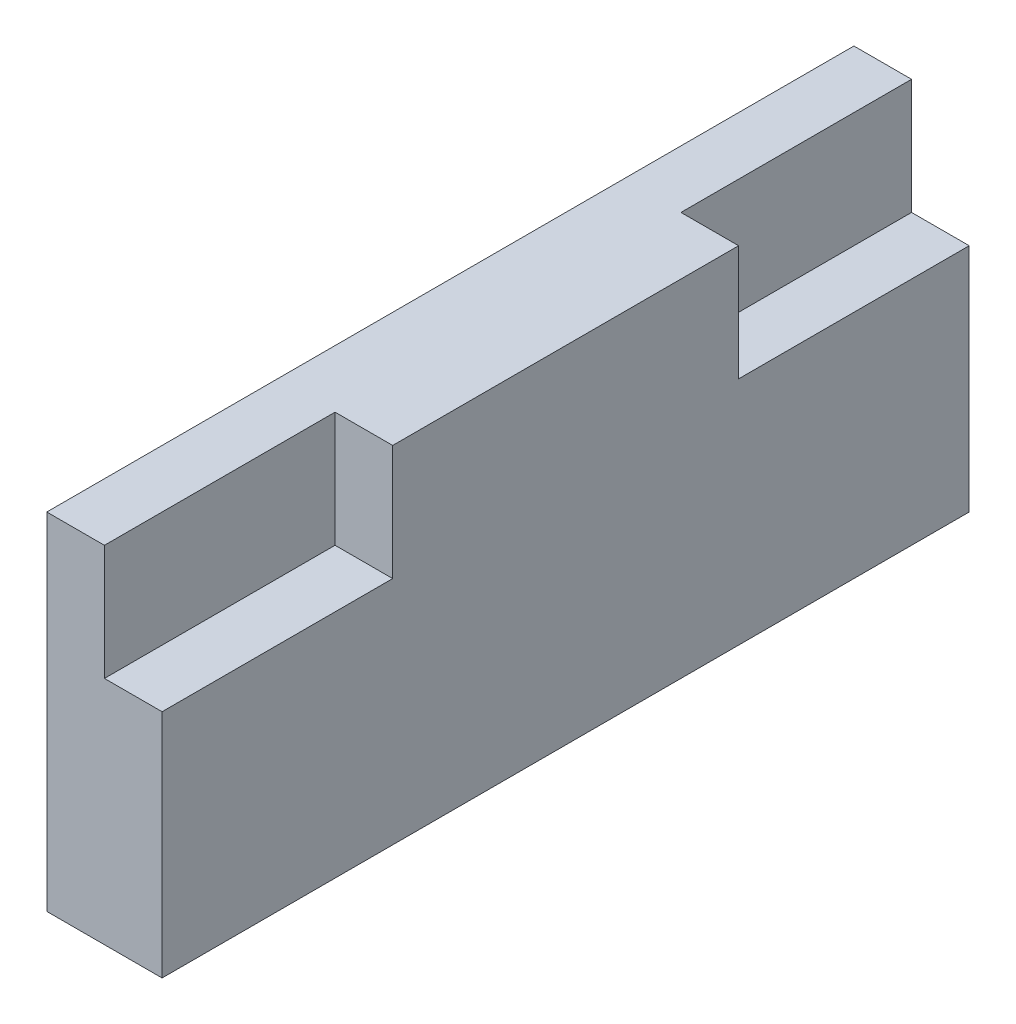
ISO-10303-21;
HEADER;
FILE_DESCRIPTION(('STEP AP214'),'2;1');
FILE_NAME('part.step','',(''),(''),'','','');
FILE_SCHEMA(('AUTOMOTIVE_DESIGN { 1 0 10303 214 1 1 1 1 }'));
ENDSEC;
DATA;
#1=APPLICATION_CONTEXT('core data for automotive mechanical design processes');
#2=APPLICATION_PROTOCOL_DEFINITION('international standard','automotive_design',2000,#1);
#3=PRODUCT_CONTEXT('',#1,'mechanical');
#4=PRODUCT('Part','Part','',(#3));
#5=PRODUCT_RELATED_PRODUCT_CATEGORY('part','',(#4));
#6=PRODUCT_DEFINITION_FORMATION('','',#4);
#7=PRODUCT_DEFINITION_CONTEXT('part definition',#1,'design');
#8=PRODUCT_DEFINITION('design','',#6,#7);
#9=PRODUCT_DEFINITION_SHAPE('','',#8);
#10=(LENGTH_UNIT() NAMED_UNIT(*) SI_UNIT(.MILLI.,.METRE.));
#11=(NAMED_UNIT(*) PLANE_ANGLE_UNIT() SI_UNIT($,.RADIAN.));
#12=(NAMED_UNIT(*) SI_UNIT($,.STERADIAN.) SOLID_ANGLE_UNIT());
#13=UNCERTAINTY_MEASURE_WITH_UNIT(LENGTH_MEASURE(1.E-05),#10,'distance_accuracy_value','');
#14=(GEOMETRIC_REPRESENTATION_CONTEXT(3) GLOBAL_UNCERTAINTY_ASSIGNED_CONTEXT((#13)) GLOBAL_UNIT_ASSIGNED_CONTEXT((#10,
#11,#12)) REPRESENTATION_CONTEXT('',''));
#15=CARTESIAN_POINT('',(0.,0.,0.));
#16=DIRECTION('',(0.,0.,1.));
#17=DIRECTION('',(1.,0.,0.));
#18=AXIS2_PLACEMENT_3D('',#15,#16,#17);
#19=CARTESIAN_POINT('',(-138.05775862069,76.2,-116.243318965517));
#20=DIRECTION('',(1.,0.,0.));
#21=DIRECTION('',(0.,0.,-1.));
#22=AXIS2_PLACEMENT_3D('',#19,#20,#21);
#23=PLANE('',#22);
#24=DIRECTION('',(0.,0.,1.));
#25=VECTOR('',#24,1.);
#26=CARTESIAN_POINT('',(-138.05775862069,0.,-116.243318965517));
#27=LINE('',#26,#25);
#28=CARTESIAN_POINT('',(-138.05775862069,0.,-116.243318965517));
#29=VERTEX_POINT('',#28);
#30=CARTESIAN_POINT('',(-138.05775862069,0.,61.5566810344828));
#31=VERTEX_POINT('',#30);
#32=EDGE_CURVE('E170',#29,#31,#27,.T.);
#33=ORIENTED_EDGE('',*,*,#32,.T.);
#34=DIRECTION('',(0.,-1.,0.));
#35=VECTOR('',#34,1.);
#36=CARTESIAN_POINT('',(-138.05775862069,76.2,61.5566810344828));
#37=LINE('',#36,#35);
#38=CARTESIAN_POINT('',(-138.05775862069,76.2,61.5566810344828));
#39=VERTEX_POINT('',#38);
#40=EDGE_CURVE('E11',#39,#31,#37,.T.);
#41=ORIENTED_EDGE('',*,*,#40,.F.);
#42=DIRECTION('',(0.,0.,1.));
#43=VECTOR('',#42,1.);
#44=CARTESIAN_POINT('',(-138.05775862069,76.2,-116.243318965517));
#45=LINE('',#44,#43);
#46=CARTESIAN_POINT('',(-138.05775862069,76.2,-116.243318965517));
#47=VERTEX_POINT('',#46);
#48=EDGE_CURVE('E158',#47,#39,#45,.T.);
#49=ORIENTED_EDGE('',*,*,#48,.F.);
#50=DIRECTION('',(0.,-1.,0.));
#51=VECTOR('',#50,1.);
#52=CARTESIAN_POINT('',(-138.05775862069,76.2,-116.243318965517));
#53=LINE('',#52,#51);
#54=EDGE_CURVE('E169',#47,#29,#53,.T.);
#55=ORIENTED_EDGE('',*,*,#54,.T.);
#56=EDGE_LOOP('',(#33,#41,#49,#55));
#57=FACE_BOUND('',#56,.T.);
#58=ADVANCED_FACE('F33',(#57),#23,.F.);
#59=CARTESIAN_POINT('',(-138.05775862069,76.2,61.5566810344828));
#60=DIRECTION('',(0.,0.,-1.));
#61=DIRECTION('',(-1.,0.,0.));
#62=AXIS2_PLACEMENT_3D('',#59,#60,#61);
#63=PLANE('',#62);
#64=DIRECTION('',(0.,-1.,0.));
#65=VECTOR('',#64,1.);
#66=CARTESIAN_POINT('',(-112.65775862069,76.2,61.5566810344828));
#67=LINE('',#66,#65);
#68=CARTESIAN_POINT('',(-112.65775862069,50.8,61.5566810344828));
#69=VERTEX_POINT('',#68);
#70=CARTESIAN_POINT('',(-112.65775862069,0.,61.5566810344828));
#71=VERTEX_POINT('',#70);
#72=EDGE_CURVE('E40',#69,#71,#67,.T.);
#73=ORIENTED_EDGE('',*,*,#72,.F.);
#74=DIRECTION('',(1.,0.,0.));
#75=VECTOR('',#74,1.);
#76=CARTESIAN_POINT('',(-125.35775862069,50.8,61.5566810344828));
#77=LINE('',#76,#75);
#78=CARTESIAN_POINT('',(-125.35775862069,50.8,61.5566810344828));
#79=VERTEX_POINT('',#78);
#80=EDGE_CURVE('E115',#79,#69,#77,.T.);
#81=ORIENTED_EDGE('',*,*,#80,.F.);
#82=DIRECTION('',(0.,-1.,0.));
#83=VECTOR('',#82,1.);
#84=CARTESIAN_POINT('',(-125.35775862069,76.2,61.5566810344828));
#85=LINE('',#84,#83);
#86=CARTESIAN_POINT('',(-125.35775862069,76.2,61.5566810344828));
#87=VERTEX_POINT('',#86);
#88=EDGE_CURVE('E118',#87,#79,#85,.T.);
#89=ORIENTED_EDGE('',*,*,#88,.F.);
#90=DIRECTION('',(1.,0.,0.));
#91=VECTOR('',#90,1.);
#92=CARTESIAN_POINT('',(-138.05775862069,76.2,61.5566810344828));
#93=LINE('',#92,#91);
#94=EDGE_CURVE('E161',#39,#87,#93,.T.);
#95=ORIENTED_EDGE('',*,*,#94,.F.);
#96=ORIENTED_EDGE('',*,*,#40,.T.);
#97=DIRECTION('',(1.,0.,0.));
#98=VECTOR('',#97,1.);
#99=CARTESIAN_POINT('',(-138.05775862069,0.,61.5566810344828));
#100=LINE('',#99,#98);
#101=EDGE_CURVE('E173',#31,#71,#100,.T.);
#102=ORIENTED_EDGE('',*,*,#101,.T.);
#103=EDGE_LOOP('',(#73,#81,#89,#95,#96,#102));
#104=FACE_BOUND('',#103,.T.);
#105=ADVANCED_FACE('F129',(#104),#63,.F.);
#106=CARTESIAN_POINT('',(-112.65775862069,76.2,-116.243318965517));
#107=DIRECTION('',(-1.,0.,0.));
#108=DIRECTION('',(0.,0.,1.));
#109=AXIS2_PLACEMENT_3D('',#106,#107,#108);
#110=PLANE('',#109);
#111=DIRECTION('',(0.,0.,-1.));
#112=VECTOR('',#111,1.);
#113=CARTESIAN_POINT('',(-112.65775862069,76.2,-116.243318965517));
#114=LINE('',#113,#112);
#115=CARTESIAN_POINT('',(-112.65775862069,76.2,10.7566810344828));
#116=VERTEX_POINT('',#115);
#117=CARTESIAN_POINT('',(-112.65775862069,76.2,-65.4433189655172));
#118=VERTEX_POINT('',#117);
#119=EDGE_CURVE('E164',#116,#118,#114,.T.);
#120=ORIENTED_EDGE('',*,*,#119,.F.);
#121=DIRECTION('',(0.,1.,0.));
#122=VECTOR('',#121,1.);
#123=CARTESIAN_POINT('',(-112.65775862069,76.2,10.7566810344828));
#124=LINE('',#123,#122);
#125=CARTESIAN_POINT('',(-112.65775862069,50.8,10.7566810344828));
#126=VERTEX_POINT('',#125);
#127=EDGE_CURVE('E126',#126,#116,#124,.T.);
#128=ORIENTED_EDGE('',*,*,#127,.F.);
#129=DIRECTION('',(0.,0.,-1.));
#130=VECTOR('',#129,1.);
#131=CARTESIAN_POINT('',(-112.65775862069,50.8,61.5566810344828));
#132=LINE('',#131,#130);
#133=EDGE_CURVE('E154',#69,#126,#132,.T.);
#134=ORIENTED_EDGE('',*,*,#133,.F.);
#135=ORIENTED_EDGE('',*,*,#72,.T.);
#136=DIRECTION('',(0.,0.,-1.));
#137=VECTOR('',#136,1.);
#138=CARTESIAN_POINT('',(-112.65775862069,0.,-116.243318965517));
#139=LINE('',#138,#137);
#140=CARTESIAN_POINT('',(-112.65775862069,0.,-116.243318965517));
#141=VERTEX_POINT('',#140);
#142=EDGE_CURVE('E175',#71,#141,#139,.T.);
#143=ORIENTED_EDGE('',*,*,#142,.T.);
#144=DIRECTION('',(0.,-1.,0.));
#145=VECTOR('',#144,1.);
#146=CARTESIAN_POINT('',(-112.65775862069,76.2,-116.243318965517));
#147=LINE('',#146,#145);
#148=CARTESIAN_POINT('',(-112.65775862069,50.8,-116.243318965517));
#149=VERTEX_POINT('',#148);
#150=EDGE_CURVE('E181',#149,#141,#147,.T.);
#151=ORIENTED_EDGE('',*,*,#150,.F.);
#152=DIRECTION('',(0.,0.,-1.));
#153=VECTOR('',#152,1.);
#154=CARTESIAN_POINT('',(-112.65775862069,50.8,-116.243318965517));
#155=LINE('',#154,#153);
#156=CARTESIAN_POINT('',(-112.65775862069,50.8,-65.4433189655172));
#157=VERTEX_POINT('',#156);
#158=EDGE_CURVE('E139',#157,#149,#155,.T.);
#159=ORIENTED_EDGE('',*,*,#158,.F.);
#160=DIRECTION('',(0.,-1.,0.));
#161=VECTOR('',#160,1.);
#162=CARTESIAN_POINT('',(-112.65775862069,76.2,-65.4433189655172));
#163=LINE('',#162,#161);
#164=EDGE_CURVE('E147',#118,#157,#163,.T.);
#165=ORIENTED_EDGE('',*,*,#164,.F.);
#166=EDGE_LOOP('',(#120,#128,#134,#135,#143,#151,#159,#165));
#167=FACE_BOUND('',#166,.T.);
#168=ADVANCED_FACE('F184',(#167),#110,.F.);
#169=CARTESIAN_POINT('',(-138.05775862069,76.2,-116.243318965517));
#170=DIRECTION('',(0.,0.,1.));
#171=DIRECTION('',(1.,0.,0.));
#172=AXIS2_PLACEMENT_3D('',#169,#170,#171);
#173=PLANE('',#172);
#174=DIRECTION('',(0.,1.,0.));
#175=VECTOR('',#174,1.);
#176=CARTESIAN_POINT('',(-125.35775862069,76.2,-116.243318965517));
#177=LINE('',#176,#175);
#178=CARTESIAN_POINT('',(-125.35775862069,50.8,-116.243318965517));
#179=VERTEX_POINT('',#178);
#180=CARTESIAN_POINT('',(-125.35775862069,76.2,-116.243318965517));
#181=VERTEX_POINT('',#180);
#182=EDGE_CURVE('E55',#179,#181,#177,.T.);
#183=ORIENTED_EDGE('',*,*,#182,.F.);
#184=DIRECTION('',(1.,0.,0.));
#185=VECTOR('',#184,1.);
#186=CARTESIAN_POINT('',(-125.35775862069,50.8,-116.243318965517));
#187=LINE('',#186,#185);
#188=EDGE_CURVE('E151',#179,#149,#187,.T.);
#189=ORIENTED_EDGE('',*,*,#188,.T.);
#190=ORIENTED_EDGE('',*,*,#150,.T.);
#191=DIRECTION('',(-1.,0.,0.));
#192=VECTOR('',#191,1.);
#193=CARTESIAN_POINT('',(-138.05775862069,0.,-116.243318965517));
#194=LINE('',#193,#192);
#195=EDGE_CURVE('E162',#141,#29,#194,.T.);
#196=ORIENTED_EDGE('',*,*,#195,.T.);
#197=ORIENTED_EDGE('',*,*,#54,.F.);
#198=DIRECTION('',(-1.,0.,0.));
#199=VECTOR('',#198,1.);
#200=CARTESIAN_POINT('',(-138.05775862069,76.2,-116.243318965517));
#201=LINE('',#200,#199);
#202=EDGE_CURVE('E167',#181,#47,#201,.T.);
#203=ORIENTED_EDGE('',*,*,#202,.F.);
#204=EDGE_LOOP('',(#183,#189,#190,#196,#197,#203));
#205=FACE_BOUND('',#204,.T.);
#206=ADVANCED_FACE('F195',(#205),#173,.F.);
#207=CARTESIAN_POINT('',(0.,76.2,0.));
#208=DIRECTION('',(0.,1.,0.));
#209=DIRECTION('',(0.,0.,1.));
#210=AXIS2_PLACEMENT_3D('',#207,#208,#209);
#211=PLANE('',#210);
#212=DIRECTION('',(1.,0.,0.));
#213=VECTOR('',#212,1.);
#214=CARTESIAN_POINT('',(-125.35775862069,76.2,10.7566810344828));
#215=LINE('',#214,#213);
#216=CARTESIAN_POINT('',(-125.35775862069,76.2,10.7566810344828));
#217=VERTEX_POINT('',#216);
#218=EDGE_CURVE('E132',#217,#116,#215,.T.);
#219=ORIENTED_EDGE('',*,*,#218,.T.);
#220=ORIENTED_EDGE('',*,*,#119,.T.);
#221=DIRECTION('',(1.,0.,0.));
#222=VECTOR('',#221,1.);
#223=CARTESIAN_POINT('',(-125.35775862069,76.2,-65.4433189655172));
#224=LINE('',#223,#222);
#225=CARTESIAN_POINT('',(-125.35775862069,76.2,-65.4433189655172));
#226=VERTEX_POINT('',#225);
#227=EDGE_CURVE('E146',#226,#118,#224,.T.);
#228=ORIENTED_EDGE('',*,*,#227,.F.);
#229=DIRECTION('',(0.,0.,1.));
#230=VECTOR('',#229,1.);
#231=CARTESIAN_POINT('',(-125.35775862069,76.2,-116.243318965517));
#232=LINE('',#231,#230);
#233=EDGE_CURVE('E138',#181,#226,#232,.T.);
#234=ORIENTED_EDGE('',*,*,#233,.F.);
#235=ORIENTED_EDGE('',*,*,#202,.T.);
#236=ORIENTED_EDGE('',*,*,#48,.T.);
#237=ORIENTED_EDGE('',*,*,#94,.T.);
#238=DIRECTION('',(0.,0.,1.));
#239=VECTOR('',#238,1.);
#240=CARTESIAN_POINT('',(-125.35775862069,76.2,61.5566810344828));
#241=LINE('',#240,#239);
#242=EDGE_CURVE('E123',#217,#87,#241,.T.);
#243=ORIENTED_EDGE('',*,*,#242,.F.);
#244=EDGE_LOOP('',(#219,#220,#228,#234,#235,#236,#237,#243));
#245=FACE_BOUND('',#244,.T.);
#246=ADVANCED_FACE('F201',(#245),#211,.T.);
#247=CARTESIAN_POINT('',(0.,0.,0.));
#248=DIRECTION('',(0.,1.,0.));
#249=DIRECTION('',(0.,0.,1.));
#250=AXIS2_PLACEMENT_3D('',#247,#248,#249);
#251=PLANE('',#250);
#252=ORIENTED_EDGE('',*,*,#32,.F.);
#253=ORIENTED_EDGE('',*,*,#195,.F.);
#254=ORIENTED_EDGE('',*,*,#142,.F.);
#255=ORIENTED_EDGE('',*,*,#101,.F.);
#256=EDGE_LOOP('',(#252,#253,#254,#255));
#257=FACE_BOUND('',#256,.T.);
#258=ADVANCED_FACE('F192',(#257),#251,.F.);
#259=CARTESIAN_POINT('',(-125.35775862069,50.8,-116.243318965517));
#260=DIRECTION('',(0.,-1.,0.));
#261=DIRECTION('',(0.,0.,-1.));
#262=AXIS2_PLACEMENT_3D('',#259,#260,#261);
#263=PLANE('',#262);
#264=ORIENTED_EDGE('',*,*,#158,.T.);
#265=ORIENTED_EDGE('',*,*,#188,.F.);
#266=DIRECTION('',(0.,0.,-1.));
#267=VECTOR('',#266,1.);
#268=CARTESIAN_POINT('',(-125.35775862069,50.8,-116.243318965517));
#269=LINE('',#268,#267);
#270=CARTESIAN_POINT('',(-125.35775862069,50.8,-65.4433189655172));
#271=VERTEX_POINT('',#270);
#272=EDGE_CURVE('E144',#271,#179,#269,.T.);
#273=ORIENTED_EDGE('',*,*,#272,.F.);
#274=DIRECTION('',(1.,0.,0.));
#275=VECTOR('',#274,1.);
#276=CARTESIAN_POINT('',(-125.35775862069,50.8,-65.4433189655172));
#277=LINE('',#276,#275);
#278=EDGE_CURVE('E155',#271,#157,#277,.T.);
#279=ORIENTED_EDGE('',*,*,#278,.T.);
#280=EDGE_LOOP('',(#264,#265,#273,#279));
#281=FACE_BOUND('',#280,.T.);
#282=ADVANCED_FACE('F207',(#281),#263,.F.);
#283=CARTESIAN_POINT('',(-125.35775862069,76.2,-65.4433189655172));
#284=DIRECTION('',(0.,0.,1.));
#285=DIRECTION('',(1.,0.,0.));
#286=AXIS2_PLACEMENT_3D('',#283,#284,#285);
#287=PLANE('',#286);
#288=ORIENTED_EDGE('',*,*,#164,.T.);
#289=ORIENTED_EDGE('',*,*,#278,.F.);
#290=DIRECTION('',(0.,-1.,0.));
#291=VECTOR('',#290,1.);
#292=CARTESIAN_POINT('',(-125.35775862069,76.2,-65.4433189655172));
#293=LINE('',#292,#291);
#294=EDGE_CURVE('E141',#226,#271,#293,.T.);
#295=ORIENTED_EDGE('',*,*,#294,.F.);
#296=ORIENTED_EDGE('',*,*,#227,.T.);
#297=EDGE_LOOP('',(#288,#289,#295,#296));
#298=FACE_BOUND('',#297,.T.);
#299=ADVANCED_FACE('F209',(#298),#287,.F.);
#300=CARTESIAN_POINT('',(-125.35775862069,0.,0.));
#301=DIRECTION('',(-1.,0.,0.));
#302=DIRECTION('',(0.,0.,1.));
#303=AXIS2_PLACEMENT_3D('',#300,#301,#302);
#304=PLANE('',#303);
#305=ORIENTED_EDGE('',*,*,#182,.T.);
#306=ORIENTED_EDGE('',*,*,#233,.T.);
#307=ORIENTED_EDGE('',*,*,#294,.T.);
#308=ORIENTED_EDGE('',*,*,#272,.T.);
#309=EDGE_LOOP('',(#305,#306,#307,#308));
#310=FACE_BOUND('',#309,.T.);
#311=ADVANCED_FACE('F216',(#310),#304,.F.);
#312=CARTESIAN_POINT('',(-125.35775862069,76.2,10.7566810344828));
#313=DIRECTION('',(0.,0.,-1.));
#314=DIRECTION('',(-1.,0.,0.));
#315=AXIS2_PLACEMENT_3D('',#312,#313,#314);
#316=PLANE('',#315);
#317=ORIENTED_EDGE('',*,*,#127,.T.);
#318=ORIENTED_EDGE('',*,*,#218,.F.);
#319=DIRECTION('',(0.,1.,0.));
#320=VECTOR('',#319,1.);
#321=CARTESIAN_POINT('',(-125.35775862069,76.2,10.7566810344828));
#322=LINE('',#321,#320);
#323=CARTESIAN_POINT('',(-125.35775862069,50.8,10.7566810344828));
#324=VERTEX_POINT('',#323);
#325=EDGE_CURVE('E47',#324,#217,#322,.T.);
#326=ORIENTED_EDGE('',*,*,#325,.F.);
#327=DIRECTION('',(1.,0.,0.));
#328=VECTOR('',#327,1.);
#329=CARTESIAN_POINT('',(-125.35775862069,50.8,10.7566810344828));
#330=LINE('',#329,#328);
#331=EDGE_CURVE('E117',#324,#126,#330,.T.);
#332=ORIENTED_EDGE('',*,*,#331,.T.);
#333=EDGE_LOOP('',(#317,#318,#326,#332));
#334=FACE_BOUND('',#333,.T.);
#335=ADVANCED_FACE('F214',(#334),#316,.F.);
#336=CARTESIAN_POINT('',(-125.35775862069,50.8,61.5566810344828));
#337=DIRECTION('',(0.,-1.,0.));
#338=DIRECTION('',(0.,0.,-1.));
#339=AXIS2_PLACEMENT_3D('',#336,#337,#338);
#340=PLANE('',#339);
#341=ORIENTED_EDGE('',*,*,#133,.T.);
#342=ORIENTED_EDGE('',*,*,#331,.F.);
#343=DIRECTION('',(0.,0.,-1.));
#344=VECTOR('',#343,1.);
#345=CARTESIAN_POINT('',(-125.35775862069,50.8,61.5566810344828));
#346=LINE('',#345,#344);
#347=EDGE_CURVE('E110',#79,#324,#346,.T.);
#348=ORIENTED_EDGE('',*,*,#347,.F.);
#349=ORIENTED_EDGE('',*,*,#80,.T.);
#350=EDGE_LOOP('',(#341,#342,#348,#349));
#351=FACE_BOUND('',#350,.T.);
#352=ADVANCED_FACE('F113',(#351),#340,.F.);
#353=CARTESIAN_POINT('',(-125.35775862069,0.,0.));
#354=DIRECTION('',(1.,0.,0.));
#355=DIRECTION('',(0.,0.,-1.));
#356=AXIS2_PLACEMENT_3D('',#353,#354,#355);
#357=PLANE('',#356);
#358=ORIENTED_EDGE('',*,*,#88,.T.);
#359=ORIENTED_EDGE('',*,*,#347,.T.);
#360=ORIENTED_EDGE('',*,*,#325,.T.);
#361=ORIENTED_EDGE('',*,*,#242,.T.);
#362=EDGE_LOOP('',(#358,#359,#360,#361));
#363=FACE_BOUND('',#362,.T.);
#364=ADVANCED_FACE('F121',(#363),#357,.T.);
#365=CLOSED_SHELL('',(#58,#105,#168,#206,#246,#258,#282,#299,#311,#335,#352,#364));
#366=MANIFOLD_SOLID_BREP('B2',#365);
#367=ADVANCED_BREP_SHAPE_REPRESENTATION('',(#18,#366),#14);
#368=SHAPE_DEFINITION_REPRESENTATION(#9,#367);
ENDSEC;
END-ISO-10303-21;
